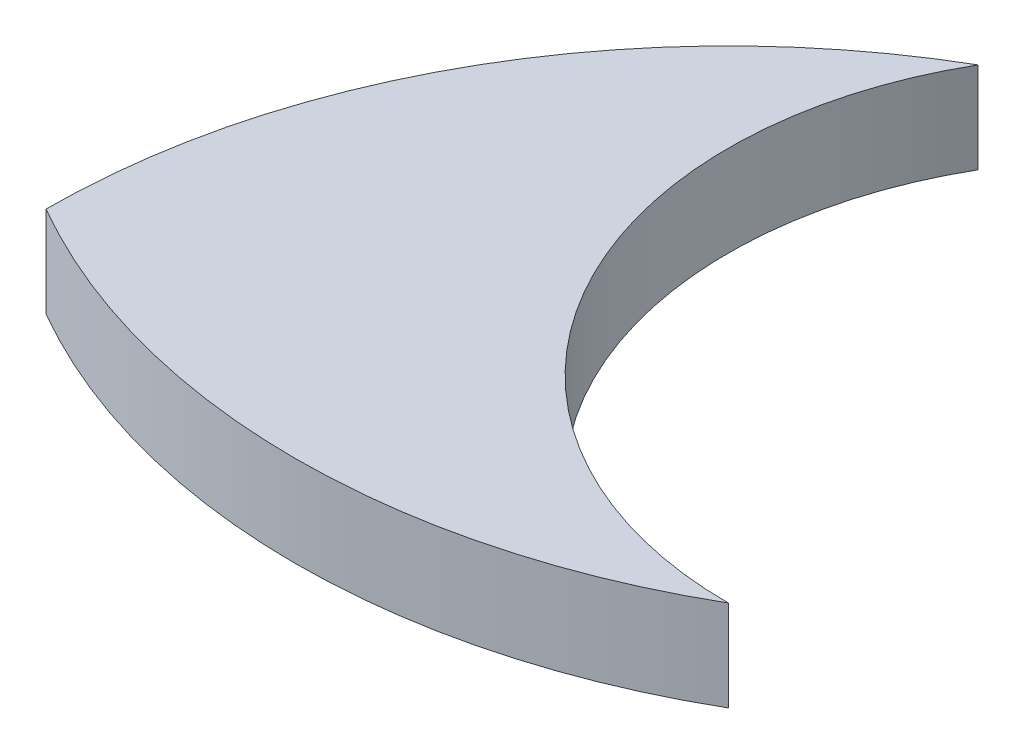
ISO-10303-21;
HEADER;
FILE_DESCRIPTION(('STEP AP214'),'2;1');
FILE_NAME('part.step','',(''),(''),'','','');
FILE_SCHEMA(('AUTOMOTIVE_DESIGN { 1 0 10303 214 1 1 1 1 }'));
ENDSEC;
DATA;
#1=APPLICATION_CONTEXT('core data for automotive mechanical design processes');
#2=APPLICATION_PROTOCOL_DEFINITION('international standard','automotive_design',2000,#1);
#3=PRODUCT_CONTEXT('',#1,'mechanical');
#4=PRODUCT('Part','Part','',(#3));
#5=PRODUCT_RELATED_PRODUCT_CATEGORY('part','',(#4));
#6=PRODUCT_DEFINITION_FORMATION('','',#4);
#7=PRODUCT_DEFINITION_CONTEXT('part definition',#1,'design');
#8=PRODUCT_DEFINITION('design','',#6,#7);
#9=PRODUCT_DEFINITION_SHAPE('','',#8);
#10=(LENGTH_UNIT() NAMED_UNIT(*) SI_UNIT(.MILLI.,.METRE.));
#11=(NAMED_UNIT(*) PLANE_ANGLE_UNIT() SI_UNIT($,.RADIAN.));
#12=(NAMED_UNIT(*) SI_UNIT($,.STERADIAN.) SOLID_ANGLE_UNIT());
#13=UNCERTAINTY_MEASURE_WITH_UNIT(LENGTH_MEASURE(1.E-05),#10,'distance_accuracy_value','');
#14=(GEOMETRIC_REPRESENTATION_CONTEXT(3) GLOBAL_UNCERTAINTY_ASSIGNED_CONTEXT((#13)) GLOBAL_UNIT_ASSIGNED_CONTEXT((#10,
#11,#12)) REPRESENTATION_CONTEXT('',''));
#15=CARTESIAN_POINT('',(0.,0.,0.));
#16=DIRECTION('',(0.,0.,1.));
#17=DIRECTION('',(1.,0.,0.));
#18=AXIS2_PLACEMENT_3D('',#15,#16,#17);
#19=CARTESIAN_POINT('',(0.,-0.01,-50.094010767585));
#20=DIRECTION('',(0.,1.,0.));
#21=DIRECTION('',(0.,0.,1.));
#22=AXIS2_PLACEMENT_3D('',#19,#20,#21);
#23=CYLINDRICAL_SURFACE('',#22,22.5166604983954);
#24=DIRECTION('',(0.,1.,0.));
#25=VECTOR('',#24,1.);
#26=CARTESIAN_POINT('',(-22.5166604983954,-0.01,-50.094010767585));
#27=LINE('',#26,#25);
#28=CARTESIAN_POINT('',(-22.5166604983954,0.,-50.094010767585));
#29=VERTEX_POINT('',#28);
#30=CARTESIAN_POINT('',(-22.5166604983954,3.,-50.094010767585));
#31=VERTEX_POINT('',#30);
#32=EDGE_CURVE('E85',#29,#31,#27,.T.);
#33=ORIENTED_EDGE('',*,*,#32,.T.);
#34=CARTESIAN_POINT('',(0.,3.,-50.094010767585));
#35=DIRECTION('',(0.,1.,0.));
#36=DIRECTION('',(0.,0.,1.));
#37=AXIS2_PLACEMENT_3D('',#34,#35,#36);
#38=CIRCLE('',#37,22.5166604983954);
#39=CARTESIAN_POINT('',(-11.2583302491977,3.,-69.594010767585));
#40=VERTEX_POINT('',#39);
#41=EDGE_CURVE('E61',#40,#31,#38,.T.);
#42=ORIENTED_EDGE('',*,*,#41,.F.);
#43=DIRECTION('',(0.,-1.,0.));
#44=VECTOR('',#43,1.);
#45=CARTESIAN_POINT('',(-11.2583302491977,3.,-69.594010767585));
#46=LINE('',#45,#44);
#47=CARTESIAN_POINT('',(-11.2583302491977,0.,-69.594010767585));
#48=VERTEX_POINT('',#47);
#49=EDGE_CURVE('E11',#40,#48,#46,.T.);
#50=ORIENTED_EDGE('',*,*,#49,.T.);
#51=CARTESIAN_POINT('',(0.,0.,-50.094010767585));
#52=DIRECTION('',(0.,1.,0.));
#53=DIRECTION('',(0.,0.,1.));
#54=AXIS2_PLACEMENT_3D('',#51,#52,#53);
#55=CIRCLE('',#54,22.5166604983954);
#56=EDGE_CURVE('E68',#48,#29,#55,.T.);
#57=ORIENTED_EDGE('',*,*,#56,.T.);
#58=EDGE_LOOP('',(#33,#42,#50,#57));
#59=FACE_BOUND('',#58,.T.);
#60=ADVANCED_FACE('F44',(#59),#23,.T.);
#61=CARTESIAN_POINT('',(0.,0.,0.));
#62=DIRECTION('',(0.,1.,0.));
#63=DIRECTION('',(0.,0.,1.));
#64=AXIS2_PLACEMENT_3D('',#61,#62,#63);
#65=PLANE('',#64);
#66=CARTESIAN_POINT('',(0.,0.,-63.0940107675848));
#67=DIRECTION('',(0.,-1.,0.));
#68=DIRECTION('',(0.,0.,-1.));
#69=AXIS2_PLACEMENT_3D('',#66,#67,#68);
#70=CIRCLE('',#69,13.);
#71=CARTESIAN_POINT('',(0.,0.,-50.094010767585));
#72=VERTEX_POINT('',#71);
#73=EDGE_CURVE('E86',#72,#48,#70,.T.);
#74=ORIENTED_EDGE('',*,*,#73,.F.);
#75=CARTESIAN_POINT('',(-11.2583302491977,0.,-69.594010767585));
#76=DIRECTION('',(0.,1.,0.));
#77=DIRECTION('',(0.,0.,1.));
#78=AXIS2_PLACEMENT_3D('',#75,#76,#77);
#79=CIRCLE('',#78,22.5166604983954);
#80=EDGE_CURVE('E91',#29,#72,#79,.T.);
#81=ORIENTED_EDGE('',*,*,#80,.F.);
#82=ORIENTED_EDGE('',*,*,#56,.F.);
#83=EDGE_LOOP('',(#74,#81,#82));
#84=FACE_BOUND('',#83,.T.);
#85=ADVANCED_FACE('F46',(#84),#65,.F.);
#86=CARTESIAN_POINT('',(-11.2583302491977,-0.01,-69.594010767585));
#87=DIRECTION('',(0.,1.,0.));
#88=DIRECTION('',(0.,0.,1.));
#89=AXIS2_PLACEMENT_3D('',#86,#87,#88);
#90=CYLINDRICAL_SURFACE('',#89,22.5166604983954);
#91=ORIENTED_EDGE('',*,*,#32,.F.);
#92=ORIENTED_EDGE('',*,*,#80,.T.);
#93=DIRECTION('',(0.,-1.,0.));
#94=VECTOR('',#93,1.);
#95=CARTESIAN_POINT('',(0.,3.,-50.094010767585));
#96=LINE('',#95,#94);
#97=CARTESIAN_POINT('',(0.,3.,-50.094010767585));
#98=VERTEX_POINT('',#97);
#99=EDGE_CURVE('E48',#98,#72,#96,.T.);
#100=ORIENTED_EDGE('',*,*,#99,.F.);
#101=CARTESIAN_POINT('',(-11.2583302491977,3.,-69.594010767585));
#102=DIRECTION('',(0.,1.,0.));
#103=DIRECTION('',(0.,0.,1.));
#104=AXIS2_PLACEMENT_3D('',#101,#102,#103);
#105=CIRCLE('',#104,22.5166604983954);
#106=EDGE_CURVE('E53',#31,#98,#105,.T.);
#107=ORIENTED_EDGE('',*,*,#106,.F.);
#108=EDGE_LOOP('',(#91,#92,#100,#107));
#109=FACE_BOUND('',#108,.T.);
#110=ADVANCED_FACE('F99',(#109),#90,.T.);
#111=CARTESIAN_POINT('',(0.,-12.01,-63.0940107675848));
#112=DIRECTION('',(0.,1.,0.));
#113=DIRECTION('',(0.,0.,1.));
#114=AXIS2_PLACEMENT_3D('',#111,#112,#113);
#115=CYLINDRICAL_SURFACE('',#114,13.);
#116=ORIENTED_EDGE('',*,*,#49,.F.);
#117=CARTESIAN_POINT('',(0.,3.,-63.0940107675848));
#118=DIRECTION('',(0.,1.,0.));
#119=DIRECTION('',(0.,0.,1.));
#120=AXIS2_PLACEMENT_3D('',#117,#118,#119);
#121=CIRCLE('',#120,13.);
#122=EDGE_CURVE('E79',#40,#98,#121,.T.);
#123=ORIENTED_EDGE('',*,*,#122,.T.);
#124=ORIENTED_EDGE('',*,*,#99,.T.);
#125=ORIENTED_EDGE('',*,*,#73,.T.);
#126=EDGE_LOOP('',(#116,#123,#124,#125));
#127=FACE_BOUND('',#126,.T.);
#128=ADVANCED_FACE('F89',(#127),#115,.F.);
#129=CARTESIAN_POINT('',(0.,3.,0.));
#130=DIRECTION('',(0.,1.,0.));
#131=DIRECTION('',(0.,0.,1.));
#132=AXIS2_PLACEMENT_3D('',#129,#130,#131);
#133=PLANE('',#132);
#134=ORIENTED_EDGE('',*,*,#106,.T.);
#135=ORIENTED_EDGE('',*,*,#122,.F.);
#136=ORIENTED_EDGE('',*,*,#41,.T.);
#137=EDGE_LOOP('',(#134,#135,#136));
#138=FACE_BOUND('',#137,.T.);
#139=ADVANCED_FACE('F81',(#138),#133,.T.);
#140=CLOSED_SHELL('',(#60,#85,#110,#128,#139));
#141=MANIFOLD_SOLID_BREP('B2',#140);
#142=ADVANCED_BREP_SHAPE_REPRESENTATION('',(#18,#141),#14);
#143=SHAPE_DEFINITION_REPRESENTATION(#9,#142);
ENDSEC;
END-ISO-10303-21;
